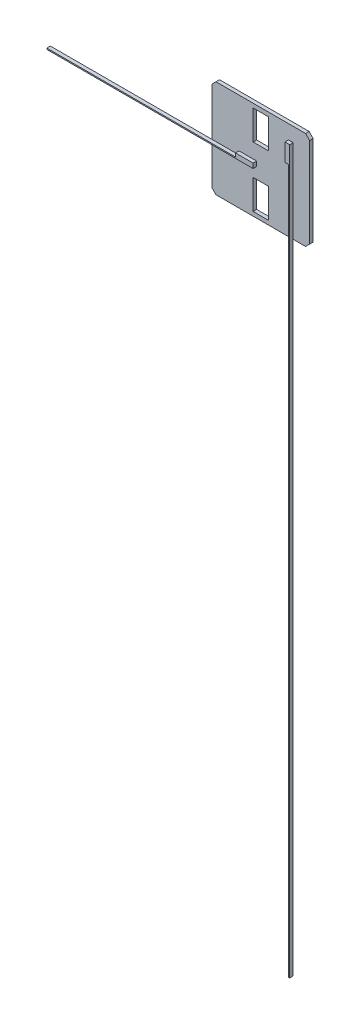
ISO-10303-21;
HEADER;
FILE_DESCRIPTION(('STEP AP214'),'2;1');
FILE_NAME('part.step','',(''),(''),'','','');
FILE_SCHEMA(('AUTOMOTIVE_DESIGN { 1 0 10303 214 1 1 1 1 }'));
ENDSEC;
DATA;
#1=APPLICATION_CONTEXT('core data for automotive mechanical design processes');
#2=APPLICATION_PROTOCOL_DEFINITION('international standard','automotive_design',2000,#1);
#3=PRODUCT_CONTEXT('',#1,'mechanical');
#4=PRODUCT('Part','Part','',(#3));
#5=PRODUCT_RELATED_PRODUCT_CATEGORY('part','',(#4));
#6=PRODUCT_DEFINITION_FORMATION('','',#4);
#7=PRODUCT_DEFINITION_CONTEXT('part definition',#1,'design');
#8=PRODUCT_DEFINITION('design','',#6,#7);
#9=PRODUCT_DEFINITION_SHAPE('','',#8);
#10=(LENGTH_UNIT() NAMED_UNIT(*) SI_UNIT(.MILLI.,.METRE.));
#11=(NAMED_UNIT(*) PLANE_ANGLE_UNIT() SI_UNIT($,.RADIAN.));
#12=(NAMED_UNIT(*) SI_UNIT($,.STERADIAN.) SOLID_ANGLE_UNIT());
#13=UNCERTAINTY_MEASURE_WITH_UNIT(LENGTH_MEASURE(1.E-05),#10,'distance_accuracy_value','');
#14=(GEOMETRIC_REPRESENTATION_CONTEXT(3) GLOBAL_UNCERTAINTY_ASSIGNED_CONTEXT((#13)) GLOBAL_UNIT_ASSIGNED_CONTEXT((#10,
#11,#12)) REPRESENTATION_CONTEXT('',''));
#15=CARTESIAN_POINT('',(0.,0.,0.));
#16=DIRECTION('',(0.,0.,1.));
#17=DIRECTION('',(1.,0.,0.));
#18=AXIS2_PLACEMENT_3D('',#15,#16,#17);
#19=CARTESIAN_POINT('',(0.,0.,3.));
#20=DIRECTION('',(0.,0.,1.));
#21=DIRECTION('',(1.,0.,0.));
#22=AXIS2_PLACEMENT_3D('',#19,#20,#21);
#23=PLANE('',#22);
#24=DIRECTION('',(1.,0.,0.));
#25=VECTOR('',#24,1.);
#26=CARTESIAN_POINT('',(-6.50000000000001,-38.,3.));
#27=LINE('',#26,#25);
#28=CARTESIAN_POINT('',(-6.50000000000001,-38.,3.));
#29=VERTEX_POINT('',#28);
#30=CARTESIAN_POINT('',(6.49999999999999,-38.,3.));
#31=VERTEX_POINT('',#30);
#32=EDGE_CURVE('E337',#29,#31,#27,.T.);
#33=ORIENTED_EDGE('',*,*,#32,.F.);
#34=DIRECTION('',(0.,-1.,0.));
#35=VECTOR('',#34,1.);
#36=CARTESIAN_POINT('',(-6.50000000000001,-38.,3.));
#37=LINE('',#36,#35);
#38=CARTESIAN_POINT('',(-6.50000000000001,-13.,3.));
#39=VERTEX_POINT('',#38);
#40=EDGE_CURVE('E342',#39,#29,#37,.T.);
#41=ORIENTED_EDGE('',*,*,#40,.F.);
#42=DIRECTION('',(-1.,0.,0.));
#43=VECTOR('',#42,1.);
#44=CARTESIAN_POINT('',(-6.50000000000001,-13.,3.));
#45=LINE('',#44,#43);
#46=CARTESIAN_POINT('',(6.49999999999999,-13.,3.));
#47=VERTEX_POINT('',#46);
#48=EDGE_CURVE('E356',#47,#39,#45,.T.);
#49=ORIENTED_EDGE('',*,*,#48,.F.);
#50=DIRECTION('',(0.,1.,0.));
#51=VECTOR('',#50,1.);
#52=CARTESIAN_POINT('',(6.49999999999999,-38.,3.));
#53=LINE('',#52,#51);
#54=EDGE_CURVE('E353',#31,#47,#53,.T.);
#55=ORIENTED_EDGE('',*,*,#54,.F.);
#56=EDGE_LOOP('',(#33,#41,#49,#55));
#57=FACE_BOUND('',#56,.T.);
#58=DIRECTION('',(0.,-1.,0.));
#59=VECTOR('',#58,1.);
#60=CARTESIAN_POINT('',(-6.50000000000001,38.,3.));
#61=LINE('',#60,#59);
#62=CARTESIAN_POINT('',(-6.50000000000001,38.,3.));
#63=VERTEX_POINT('',#62);
#64=CARTESIAN_POINT('',(-6.50000000000001,13.,3.));
#65=VERTEX_POINT('',#64);
#66=EDGE_CURVE('E363',#63,#65,#61,.T.);
#67=ORIENTED_EDGE('',*,*,#66,.F.);
#68=DIRECTION('',(-1.,0.,0.));
#69=VECTOR('',#68,1.);
#70=CARTESIAN_POINT('',(-6.50000000000001,38.,3.));
#71=LINE('',#70,#69);
#72=CARTESIAN_POINT('',(6.49999999999999,38.,3.));
#73=VERTEX_POINT('',#72);
#74=EDGE_CURVE('E374',#73,#63,#71,.T.);
#75=ORIENTED_EDGE('',*,*,#74,.F.);
#76=DIRECTION('',(0.,1.,0.));
#77=VECTOR('',#76,1.);
#78=CARTESIAN_POINT('',(6.49999999999999,38.,3.));
#79=LINE('',#78,#77);
#80=CARTESIAN_POINT('',(6.49999999999999,13.,3.));
#81=VERTEX_POINT('',#80);
#82=EDGE_CURVE('E388',#81,#73,#79,.T.);
#83=ORIENTED_EDGE('',*,*,#82,.F.);
#84=DIRECTION('',(1.,0.,0.));
#85=VECTOR('',#84,1.);
#86=CARTESIAN_POINT('',(-6.50000000000001,13.,3.));
#87=LINE('',#86,#85);
#88=EDGE_CURVE('E385',#65,#81,#87,.T.);
#89=ORIENTED_EDGE('',*,*,#88,.F.);
#90=EDGE_LOOP('',(#67,#75,#83,#89));
#91=FACE_BOUND('',#90,.T.);
#92=DIRECTION('',(-1.,0.,0.));
#93=VECTOR('',#92,1.);
#94=CARTESIAN_POINT('',(23.5,29.5,3.));
#95=LINE('',#94,#93);
#96=CARTESIAN_POINT('',(27.5,29.5,3.));
#97=VERTEX_POINT('',#96);
#98=CARTESIAN_POINT('',(23.5,29.5,3.));
#99=VERTEX_POINT('',#98);
#100=EDGE_CURVE('E300',#97,#99,#95,.T.);
#101=ORIENTED_EDGE('',*,*,#100,.F.);
#102=DIRECTION('',(0.,1.,0.));
#103=VECTOR('',#102,1.);
#104=CARTESIAN_POINT('',(27.5,29.5,3.));
#105=LINE('',#104,#103);
#106=CARTESIAN_POINT('',(27.5,-41.5,2.99999999999999));
#107=VERTEX_POINT('',#106);
#108=EDGE_CURVE('E244',#107,#97,#105,.T.);
#109=ORIENTED_EDGE('',*,*,#108,.F.);
#110=DIRECTION('',(1.,0.,0.));
#111=VECTOR('',#110,1.);
#112=CARTESIAN_POINT('',(41.5,-41.5,3.));
#113=LINE('',#112,#111);
#114=CARTESIAN_POINT('',(38.,-41.5,3.));
#115=VERTEX_POINT('',#114);
#116=EDGE_CURVE('E405',#107,#115,#113,.T.);
#117=ORIENTED_EDGE('',*,*,#116,.T.);
#118=DIRECTION('',(-0.707106781186549,-0.707106781186546,0.));
#119=VECTOR('',#118,1.);
#120=CARTESIAN_POINT('',(39.7499999999999,-39.7500000000001,3.));
#121=LINE('',#120,#119);
#122=CARTESIAN_POINT('',(41.5,-38.,3.));
#123=VERTEX_POINT('',#122);
#124=EDGE_CURVE('E449',#115,#123,#121,.F.);
#125=ORIENTED_EDGE('',*,*,#124,.T.);
#126=DIRECTION('',(0.,1.,0.));
#127=VECTOR('',#126,1.);
#128=CARTESIAN_POINT('',(41.5,-41.5,3.));
#129=LINE('',#128,#127);
#130=CARTESIAN_POINT('',(41.5,38.,3.));
#131=VERTEX_POINT('',#130);
#132=EDGE_CURVE('E410',#123,#131,#129,.T.);
#133=ORIENTED_EDGE('',*,*,#132,.T.);
#134=DIRECTION('',(0.707106781186546,-0.707106781186549,0.));
#135=VECTOR('',#134,1.);
#136=CARTESIAN_POINT('',(39.7500000000001,39.7499999999999,3.));
#137=LINE('',#136,#135);
#138=CARTESIAN_POINT('',(38.,41.5,3.));
#139=VERTEX_POINT('',#138);
#140=EDGE_CURVE('E447',#131,#139,#137,.F.);
#141=ORIENTED_EDGE('',*,*,#140,.T.);
#142=DIRECTION('',(-1.,0.,0.));
#143=VECTOR('',#142,1.);
#144=CARTESIAN_POINT('',(41.5,41.5,3.));
#145=LINE('',#144,#143);
#146=CARTESIAN_POINT('',(-38.,41.5,3.));
#147=VERTEX_POINT('',#146);
#148=EDGE_CURVE('E413',#139,#147,#145,.T.);
#149=ORIENTED_EDGE('',*,*,#148,.T.);
#150=DIRECTION('',(0.707106781186549,0.707106781186546,0.));
#151=VECTOR('',#150,1.);
#152=CARTESIAN_POINT('',(-39.7499999999999,39.7500000000001,3.));
#153=LINE('',#152,#151);
#154=CARTESIAN_POINT('',(-41.5,38.,3.));
#155=VERTEX_POINT('',#154);
#156=EDGE_CURVE('E445',#147,#155,#153,.F.);
#157=ORIENTED_EDGE('',*,*,#156,.T.);
#158=DIRECTION('',(0.,-1.,0.));
#159=VECTOR('',#158,1.);
#160=CARTESIAN_POINT('',(-41.5,-41.5,3.));
#161=LINE('',#160,#159);
#162=CARTESIAN_POINT('',(-41.5,-2.49999999999999,3.));
#163=VERTEX_POINT('',#162);
#164=EDGE_CURVE('E402',#155,#163,#161,.T.);
#165=ORIENTED_EDGE('',*,*,#164,.T.);
#166=DIRECTION('',(1.,0.,0.));
#167=VECTOR('',#166,1.);
#168=CARTESIAN_POINT('',(-178.5,-2.49999999999999,3.));
#169=LINE('',#168,#167);
#170=CARTESIAN_POINT('',(-18.5,-2.49999999999999,3.));
#171=VERTEX_POINT('',#170);
#172=EDGE_CURVE('E284',#163,#171,#169,.T.);
#173=ORIENTED_EDGE('',*,*,#172,.T.);
#174=DIRECTION('',(0.,-1.,0.));
#175=VECTOR('',#174,1.);
#176=CARTESIAN_POINT('',(-18.5,0.500000000000007,3.));
#177=LINE('',#176,#175);
#178=CARTESIAN_POINT('',(-18.5,0.500000000000007,3.));
#179=VERTEX_POINT('',#178);
#180=EDGE_CURVE('E317',#179,#171,#177,.T.);
#181=ORIENTED_EDGE('',*,*,#180,.F.);
#182=DIRECTION('',(-1.,0.,0.));
#183=VECTOR('',#182,1.);
#184=CARTESIAN_POINT('',(-18.5,0.500000000000007,3.));
#185=LINE('',#184,#183);
#186=CARTESIAN_POINT('',(-3.49999999999999,0.500000000000007,3.));
#187=VERTEX_POINT('',#186);
#188=EDGE_CURVE('E322',#187,#179,#185,.T.);
#189=ORIENTED_EDGE('',*,*,#188,.F.);
#190=DIRECTION('',(0.,1.,0.));
#191=VECTOR('',#190,1.);
#192=CARTESIAN_POINT('',(-3.49999999999999,0.500000000000007,3.));
#193=LINE('',#192,#191);
#194=CARTESIAN_POINT('',(-3.49999999999999,-3.49999999999999,3.));
#195=VERTEX_POINT('',#194);
#196=EDGE_CURVE('E329',#195,#187,#193,.T.);
#197=ORIENTED_EDGE('',*,*,#196,.F.);
#198=DIRECTION('',(1.,0.,0.));
#199=VECTOR('',#198,1.);
#200=CARTESIAN_POINT('',(-178.5,-3.49999999999999,3.));
#201=LINE('',#200,#199);
#202=CARTESIAN_POINT('',(-41.5,-3.49999999999999,3.));
#203=VERTEX_POINT('',#202);
#204=EDGE_CURVE('E271',#203,#195,#201,.T.);
#205=ORIENTED_EDGE('',*,*,#204,.F.);
#206=CARTESIAN_POINT('',(-41.5,-38.,3.));
#207=VERTEX_POINT('',#206);
#208=EDGE_CURVE('E406',#203,#207,#161,.T.);
#209=ORIENTED_EDGE('',*,*,#208,.T.);
#210=DIRECTION('',(-0.707106781186546,0.707106781186549,0.));
#211=VECTOR('',#210,1.);
#212=CARTESIAN_POINT('',(-39.7500000000001,-39.7499999999999,3.));
#213=LINE('',#212,#211);
#214=CARTESIAN_POINT('',(-38.,-41.5,3.));
#215=VERTEX_POINT('',#214);
#216=EDGE_CURVE('E451',#207,#215,#213,.F.);
#217=ORIENTED_EDGE('',*,*,#216,.T.);
#218=CARTESIAN_POINT('',(26.5,-41.5,2.99999999999999));
#219=VERTEX_POINT('',#218);
#220=EDGE_CURVE('E407',#215,#219,#113,.T.);
#221=ORIENTED_EDGE('',*,*,#220,.T.);
#222=DIRECTION('',(0.,1.,0.));
#223=VECTOR('',#222,1.);
#224=CARTESIAN_POINT('',(26.5,29.5,3.));
#225=LINE('',#224,#223);
#226=CARTESIAN_POINT('',(26.5,14.5,3.));
#227=VERTEX_POINT('',#226);
#228=EDGE_CURVE('E496',#219,#227,#225,.T.);
#229=ORIENTED_EDGE('',*,*,#228,.T.);
#230=DIRECTION('',(1.,0.,0.));
#231=VECTOR('',#230,1.);
#232=CARTESIAN_POINT('',(23.5,14.5,3.));
#233=LINE('',#232,#231);
#234=CARTESIAN_POINT('',(23.5,14.5,3.));
#235=VERTEX_POINT('',#234);
#236=EDGE_CURVE('E307',#235,#227,#233,.T.);
#237=ORIENTED_EDGE('',*,*,#236,.F.);
#238=DIRECTION('',(0.,-1.,0.));
#239=VECTOR('',#238,1.);
#240=CARTESIAN_POINT('',(23.5,29.5,3.));
#241=LINE('',#240,#239);
#242=EDGE_CURVE('E296',#99,#235,#241,.T.);
#243=ORIENTED_EDGE('',*,*,#242,.F.);
#244=EDGE_LOOP('',(#101,#109,#117,#125,#133,#141,#149,#157,#165,#173,#181,#189,#197,#205,#209,
#217,#221,#229,#237,#243));
#245=FACE_BOUND('',#244,.T.);
#246=ADVANCED_FACE('F35',(#57,#91,#245),#23,.T.);
#247=CARTESIAN_POINT('',(-41.5,-41.5,3.));
#248=DIRECTION('',(1.,0.,0.));
#249=DIRECTION('',(0.,0.,-1.));
#250=AXIS2_PLACEMENT_3D('',#247,#248,#249);
#251=PLANE('',#250);
#252=DIRECTION('',(0.,-1.,0.));
#253=VECTOR('',#252,1.);
#254=CARTESIAN_POINT('',(-41.5,-41.5,0.));
#255=LINE('',#254,#253);
#256=CARTESIAN_POINT('',(-41.5,38.,0.));
#257=VERTEX_POINT('',#256);
#258=CARTESIAN_POINT('',(-41.5,-38.,0.));
#259=VERTEX_POINT('',#258);
#260=EDGE_CURVE('E395',#257,#259,#255,.T.);
#261=ORIENTED_EDGE('',*,*,#260,.T.);
#262=DIRECTION('',(0.,0.,1.));
#263=VECTOR('',#262,1.);
#264=CARTESIAN_POINT('',(-41.5,-38.,3.));
#265=LINE('',#264,#263);
#266=EDGE_CURVE('E442',#259,#207,#265,.T.);
#267=ORIENTED_EDGE('',*,*,#266,.T.);
#268=ORIENTED_EDGE('',*,*,#208,.F.);
#269=DIRECTION('',(0.,-1.,0.));
#270=VECTOR('',#269,1.);
#271=CARTESIAN_POINT('',(-41.5,-41.5,3.));
#272=LINE('',#271,#270);
#273=EDGE_CURVE('E294',#163,#203,#272,.T.);
#274=ORIENTED_EDGE('',*,*,#273,.F.);
#275=ORIENTED_EDGE('',*,*,#164,.F.);
#276=DIRECTION('',(0.,0.,-1.));
#277=VECTOR('',#276,1.);
#278=CARTESIAN_POINT('',(-41.5,38.,3.));
#279=LINE('',#278,#277);
#280=EDGE_CURVE('E439',#155,#257,#279,.T.);
#281=ORIENTED_EDGE('',*,*,#280,.T.);
#282=EDGE_LOOP('',(#261,#267,#268,#274,#275,#281));
#283=FACE_BOUND('',#282,.T.);
#284=ADVANCED_FACE('F481',(#283),#251,.F.);
#285=CARTESIAN_POINT('',(41.5,-41.5,3.));
#286=DIRECTION('',(0.,1.,0.));
#287=DIRECTION('',(-1.,0.,0.));
#288=AXIS2_PLACEMENT_3D('',#285,#286,#287);
#289=PLANE('',#288);
#290=ORIENTED_EDGE('',*,*,#220,.F.);
#291=DIRECTION('',(0.,0.,-1.));
#292=VECTOR('',#291,1.);
#293=CARTESIAN_POINT('',(-38.,-41.5,3.));
#294=LINE('',#293,#292);
#295=CARTESIAN_POINT('',(-38.,-41.5,0.));
#296=VERTEX_POINT('',#295);
#297=EDGE_CURVE('E428',#215,#296,#294,.T.);
#298=ORIENTED_EDGE('',*,*,#297,.T.);
#299=DIRECTION('',(1.,0.,0.));
#300=VECTOR('',#299,1.);
#301=CARTESIAN_POINT('',(41.5,-41.5,0.));
#302=LINE('',#301,#300);
#303=CARTESIAN_POINT('',(38.,-41.5,0.));
#304=VERTEX_POINT('',#303);
#305=EDGE_CURVE('E418',#296,#304,#302,.T.);
#306=ORIENTED_EDGE('',*,*,#305,.T.);
#307=DIRECTION('',(0.,0.,1.));
#308=VECTOR('',#307,1.);
#309=CARTESIAN_POINT('',(38.,-41.5,3.));
#310=LINE('',#309,#308);
#311=EDGE_CURVE('E415',#304,#115,#310,.T.);
#312=ORIENTED_EDGE('',*,*,#311,.T.);
#313=ORIENTED_EDGE('',*,*,#116,.F.);
#314=DIRECTION('',(1.,0.,0.));
#315=VECTOR('',#314,1.);
#316=CARTESIAN_POINT('',(41.5,-41.5,2.99999999999999));
#317=LINE('',#316,#315);
#318=EDGE_CURVE('E261',#219,#107,#317,.T.);
#319=ORIENTED_EDGE('',*,*,#318,.F.);
#320=EDGE_LOOP('',(#290,#298,#306,#312,#313,#319));
#321=FACE_BOUND('',#320,.T.);
#322=ADVANCED_FACE('F490',(#321),#289,.F.);
#323=CARTESIAN_POINT('',(41.5,-41.5,3.));
#324=DIRECTION('',(-1.,0.,0.));
#325=DIRECTION('',(0.,0.,1.));
#326=AXIS2_PLACEMENT_3D('',#323,#324,#325);
#327=PLANE('',#326);
#328=ORIENTED_EDGE('',*,*,#132,.F.);
#329=DIRECTION('',(0.,0.,-1.));
#330=VECTOR('',#329,1.);
#331=CARTESIAN_POINT('',(41.5,-38.,3.));
#332=LINE('',#331,#330);
#333=CARTESIAN_POINT('',(41.5,-38.,0.));
#334=VERTEX_POINT('',#333);
#335=EDGE_CURVE('E455',#123,#334,#332,.T.);
#336=ORIENTED_EDGE('',*,*,#335,.T.);
#337=DIRECTION('',(0.,1.,0.));
#338=VECTOR('',#337,1.);
#339=CARTESIAN_POINT('',(41.5,-41.5,0.));
#340=LINE('',#339,#338);
#341=CARTESIAN_POINT('',(41.5,38.,0.));
#342=VERTEX_POINT('',#341);
#343=EDGE_CURVE('E421',#334,#342,#340,.T.);
#344=ORIENTED_EDGE('',*,*,#343,.T.);
#345=DIRECTION('',(0.,0.,1.));
#346=VECTOR('',#345,1.);
#347=CARTESIAN_POINT('',(41.5,38.,3.));
#348=LINE('',#347,#346);
#349=EDGE_CURVE('E453',#342,#131,#348,.T.);
#350=ORIENTED_EDGE('',*,*,#349,.T.);
#351=EDGE_LOOP('',(#328,#336,#344,#350));
#352=FACE_BOUND('',#351,.T.);
#353=ADVANCED_FACE('F461',(#352),#327,.F.);
#354=CARTESIAN_POINT('',(41.5,41.5,3.));
#355=DIRECTION('',(0.,-1.,0.));
#356=DIRECTION('',(1.,0.,0.));
#357=AXIS2_PLACEMENT_3D('',#354,#355,#356);
#358=PLANE('',#357);
#359=ORIENTED_EDGE('',*,*,#148,.F.);
#360=DIRECTION('',(0.,0.,-1.));
#361=VECTOR('',#360,1.);
#362=CARTESIAN_POINT('',(38.,41.5,3.));
#363=LINE('',#362,#361);
#364=CARTESIAN_POINT('',(38.,41.5,0.));
#365=VERTEX_POINT('',#364);
#366=EDGE_CURVE('E11',#139,#365,#363,.T.);
#367=ORIENTED_EDGE('',*,*,#366,.T.);
#368=DIRECTION('',(-1.,0.,0.));
#369=VECTOR('',#368,1.);
#370=CARTESIAN_POINT('',(41.5,41.5,0.));
#371=LINE('',#370,#369);
#372=CARTESIAN_POINT('',(-38.,41.5,0.));
#373=VERTEX_POINT('',#372);
#374=EDGE_CURVE('E424',#365,#373,#371,.T.);
#375=ORIENTED_EDGE('',*,*,#374,.T.);
#376=DIRECTION('',(0.,0.,1.));
#377=VECTOR('',#376,1.);
#378=CARTESIAN_POINT('',(-38.,41.5,3.));
#379=LINE('',#378,#377);
#380=EDGE_CURVE('E43',#373,#147,#379,.T.);
#381=ORIENTED_EDGE('',*,*,#380,.T.);
#382=EDGE_LOOP('',(#359,#367,#375,#381));
#383=FACE_BOUND('',#382,.T.);
#384=ADVANCED_FACE('F473',(#383),#358,.F.);
#385=CARTESIAN_POINT('',(0.,0.,0.));
#386=DIRECTION('',(0.,0.,1.));
#387=DIRECTION('',(1.,0.,0.));
#388=AXIS2_PLACEMENT_3D('',#385,#386,#387);
#389=PLANE('',#388);
#390=DIRECTION('',(0.,-1.,0.));
#391=VECTOR('',#390,1.);
#392=CARTESIAN_POINT('',(-6.50000000000001,-38.,0.));
#393=LINE('',#392,#391);
#394=CARTESIAN_POINT('',(-6.50000000000001,-13.,0.));
#395=VERTEX_POINT('',#394);
#396=CARTESIAN_POINT('',(-6.50000000000001,-38.,0.));
#397=VERTEX_POINT('',#396);
#398=EDGE_CURVE('E348',#395,#397,#393,.T.);
#399=ORIENTED_EDGE('',*,*,#398,.T.);
#400=DIRECTION('',(1.,0.,0.));
#401=VECTOR('',#400,1.);
#402=CARTESIAN_POINT('',(-6.50000000000001,-38.,0.));
#403=LINE('',#402,#401);
#404=CARTESIAN_POINT('',(6.49999999999999,-38.,0.));
#405=VERTEX_POINT('',#404);
#406=EDGE_CURVE('E338',#397,#405,#403,.T.);
#407=ORIENTED_EDGE('',*,*,#406,.T.);
#408=DIRECTION('',(0.,1.,0.));
#409=VECTOR('',#408,1.);
#410=CARTESIAN_POINT('',(6.49999999999999,-38.,0.));
#411=LINE('',#410,#409);
#412=CARTESIAN_POINT('',(6.49999999999999,-13.,0.));
#413=VERTEX_POINT('',#412);
#414=EDGE_CURVE('E341',#405,#413,#411,.T.);
#415=ORIENTED_EDGE('',*,*,#414,.T.);
#416=DIRECTION('',(-1.,0.,0.));
#417=VECTOR('',#416,1.);
#418=CARTESIAN_POINT('',(-6.50000000000001,-13.,0.));
#419=LINE('',#418,#417);
#420=EDGE_CURVE('E345',#413,#395,#419,.T.);
#421=ORIENTED_EDGE('',*,*,#420,.T.);
#422=EDGE_LOOP('',(#399,#407,#415,#421));
#423=FACE_BOUND('',#422,.T.);
#424=DIRECTION('',(-1.,0.,0.));
#425=VECTOR('',#424,1.);
#426=CARTESIAN_POINT('',(-6.50000000000001,38.,0.));
#427=LINE('',#426,#425);
#428=CARTESIAN_POINT('',(6.49999999999999,38.,0.));
#429=VERTEX_POINT('',#428);
#430=CARTESIAN_POINT('',(-6.50000000000001,38.,0.));
#431=VERTEX_POINT('',#430);
#432=EDGE_CURVE('E380',#429,#431,#427,.T.);
#433=ORIENTED_EDGE('',*,*,#432,.T.);
#434=DIRECTION('',(0.,-1.,0.));
#435=VECTOR('',#434,1.);
#436=CARTESIAN_POINT('',(-6.50000000000001,38.,0.));
#437=LINE('',#436,#435);
#438=CARTESIAN_POINT('',(-6.50000000000001,13.,0.));
#439=VERTEX_POINT('',#438);
#440=EDGE_CURVE('E370',#431,#439,#437,.T.);
#441=ORIENTED_EDGE('',*,*,#440,.T.);
#442=DIRECTION('',(1.,0.,0.));
#443=VECTOR('',#442,1.);
#444=CARTESIAN_POINT('',(-6.50000000000001,13.,0.));
#445=LINE('',#444,#443);
#446=CARTESIAN_POINT('',(6.49999999999999,13.,0.));
#447=VERTEX_POINT('',#446);
#448=EDGE_CURVE('E373',#439,#447,#445,.T.);
#449=ORIENTED_EDGE('',*,*,#448,.T.);
#450=DIRECTION('',(0.,1.,0.));
#451=VECTOR('',#450,1.);
#452=CARTESIAN_POINT('',(6.49999999999999,38.,0.));
#453=LINE('',#452,#451);
#454=EDGE_CURVE('E377',#447,#429,#453,.T.);
#455=ORIENTED_EDGE('',*,*,#454,.T.);
#456=EDGE_LOOP('',(#433,#441,#449,#455));
#457=FACE_BOUND('',#456,.T.);
#458=ORIENTED_EDGE('',*,*,#305,.F.);
#459=DIRECTION('',(0.707106781186546,-0.707106781186549,0.));
#460=VECTOR('',#459,1.);
#461=CARTESIAN_POINT('',(-38.,-41.5,0.));
#462=LINE('',#461,#460);
#463=EDGE_CURVE('E437',#296,#259,#462,.F.);
#464=ORIENTED_EDGE('',*,*,#463,.T.);
#465=ORIENTED_EDGE('',*,*,#260,.F.);
#466=DIRECTION('',(-0.707106781186549,-0.707106781186546,0.));
#467=VECTOR('',#466,1.);
#468=CARTESIAN_POINT('',(-41.5,38.,0.));
#469=LINE('',#468,#467);
#470=EDGE_CURVE('E431',#257,#373,#469,.F.);
#471=ORIENTED_EDGE('',*,*,#470,.T.);
#472=ORIENTED_EDGE('',*,*,#374,.F.);
#473=DIRECTION('',(-0.707106781186546,0.707106781186549,0.));
#474=VECTOR('',#473,1.);
#475=CARTESIAN_POINT('',(38.,41.5,0.));
#476=LINE('',#475,#474);
#477=EDGE_CURVE('E433',#365,#342,#476,.F.);
#478=ORIENTED_EDGE('',*,*,#477,.T.);
#479=ORIENTED_EDGE('',*,*,#343,.F.);
#480=DIRECTION('',(0.707106781186549,0.707106781186546,0.));
#481=VECTOR('',#480,1.);
#482=CARTESIAN_POINT('',(41.5,-38.,0.));
#483=LINE('',#482,#481);
#484=EDGE_CURVE('E435',#334,#304,#483,.F.);
#485=ORIENTED_EDGE('',*,*,#484,.T.);
#486=EDGE_LOOP('',(#458,#464,#465,#471,#472,#478,#479,#485));
#487=FACE_BOUND('',#486,.T.);
#488=ADVANCED_FACE('F467',(#423,#457,#487),#389,.F.);
#489=CARTESIAN_POINT('',(-6.50000000000001,38.,0.));
#490=DIRECTION('',(-1.,0.,0.));
#491=DIRECTION('',(0.,-1.,0.));
#492=AXIS2_PLACEMENT_3D('',#489,#490,#491);
#493=PLANE('',#492);
#494=ORIENTED_EDGE('',*,*,#66,.T.);
#495=DIRECTION('',(0.,0.,1.));
#496=VECTOR('',#495,1.);
#497=CARTESIAN_POINT('',(-6.50000000000001,13.,0.));
#498=LINE('',#497,#496);
#499=EDGE_CURVE('E383',#439,#65,#498,.T.);
#500=ORIENTED_EDGE('',*,*,#499,.F.);
#501=ORIENTED_EDGE('',*,*,#440,.F.);
#502=DIRECTION('',(0.,0.,1.));
#503=VECTOR('',#502,1.);
#504=CARTESIAN_POINT('',(-6.50000000000001,38.,0.));
#505=LINE('',#504,#503);
#506=EDGE_CURVE('E393',#431,#63,#505,.T.);
#507=ORIENTED_EDGE('',*,*,#506,.T.);
#508=EDGE_LOOP('',(#494,#500,#501,#507));
#509=FACE_BOUND('',#508,.T.);
#510=ADVANCED_FACE('F547',(#509),#493,.F.);
#511=CARTESIAN_POINT('',(-6.50000000000001,38.,0.));
#512=DIRECTION('',(0.,1.,0.));
#513=DIRECTION('',(-1.,0.,0.));
#514=AXIS2_PLACEMENT_3D('',#511,#512,#513);
#515=PLANE('',#514);
#516=ORIENTED_EDGE('',*,*,#74,.T.);
#517=ORIENTED_EDGE('',*,*,#506,.F.);
#518=ORIENTED_EDGE('',*,*,#432,.F.);
#519=DIRECTION('',(0.,0.,1.));
#520=VECTOR('',#519,1.);
#521=CARTESIAN_POINT('',(6.49999999999999,38.,0.));
#522=LINE('',#521,#520);
#523=EDGE_CURVE('E396',#429,#73,#522,.T.);
#524=ORIENTED_EDGE('',*,*,#523,.T.);
#525=EDGE_LOOP('',(#516,#517,#518,#524));
#526=FACE_BOUND('',#525,.T.);
#527=ADVANCED_FACE('F593',(#526),#515,.F.);
#528=CARTESIAN_POINT('',(6.49999999999999,38.,0.));
#529=DIRECTION('',(1.,0.,0.));
#530=DIRECTION('',(0.,1.,0.));
#531=AXIS2_PLACEMENT_3D('',#528,#529,#530);
#532=PLANE('',#531);
#533=ORIENTED_EDGE('',*,*,#82,.T.);
#534=ORIENTED_EDGE('',*,*,#523,.F.);
#535=ORIENTED_EDGE('',*,*,#454,.F.);
#536=DIRECTION('',(0.,0.,1.));
#537=VECTOR('',#536,1.);
#538=CARTESIAN_POINT('',(6.49999999999999,13.,0.));
#539=LINE('',#538,#537);
#540=EDGE_CURVE('E398',#447,#81,#539,.T.);
#541=ORIENTED_EDGE('',*,*,#540,.T.);
#542=EDGE_LOOP('',(#533,#534,#535,#541));
#543=FACE_BOUND('',#542,.T.);
#544=ADVANCED_FACE('F596',(#543),#532,.F.);
#545=CARTESIAN_POINT('',(-6.50000000000001,13.,0.));
#546=DIRECTION('',(0.,-1.,0.));
#547=DIRECTION('',(1.,0.,0.));
#548=AXIS2_PLACEMENT_3D('',#545,#546,#547);
#549=PLANE('',#548);
#550=ORIENTED_EDGE('',*,*,#88,.T.);
#551=ORIENTED_EDGE('',*,*,#540,.F.);
#552=ORIENTED_EDGE('',*,*,#448,.F.);
#553=ORIENTED_EDGE('',*,*,#499,.T.);
#554=EDGE_LOOP('',(#550,#551,#552,#553));
#555=FACE_BOUND('',#554,.T.);
#556=ADVANCED_FACE('F591',(#555),#549,.F.);
#557=CARTESIAN_POINT('',(-6.50000000000001,-38.,0.));
#558=DIRECTION('',(0.,-1.,0.));
#559=DIRECTION('',(1.,0.,0.));
#560=AXIS2_PLACEMENT_3D('',#557,#558,#559);
#561=PLANE('',#560);
#562=ORIENTED_EDGE('',*,*,#32,.T.);
#563=DIRECTION('',(0.,0.,1.));
#564=VECTOR('',#563,1.);
#565=CARTESIAN_POINT('',(6.49999999999999,-38.,0.));
#566=LINE('',#565,#564);
#567=EDGE_CURVE('E351',#405,#31,#566,.T.);
#568=ORIENTED_EDGE('',*,*,#567,.F.);
#569=ORIENTED_EDGE('',*,*,#406,.F.);
#570=DIRECTION('',(0.,0.,1.));
#571=VECTOR('',#570,1.);
#572=CARTESIAN_POINT('',(-6.50000000000001,-38.,0.));
#573=LINE('',#572,#571);
#574=EDGE_CURVE('E361',#397,#29,#573,.T.);
#575=ORIENTED_EDGE('',*,*,#574,.T.);
#576=EDGE_LOOP('',(#562,#568,#569,#575));
#577=FACE_BOUND('',#576,.T.);
#578=ADVANCED_FACE('F581',(#577),#561,.F.);
#579=CARTESIAN_POINT('',(-6.50000000000001,-38.,0.));
#580=DIRECTION('',(-1.,0.,0.));
#581=DIRECTION('',(0.,-1.,0.));
#582=AXIS2_PLACEMENT_3D('',#579,#580,#581);
#583=PLANE('',#582);
#584=ORIENTED_EDGE('',*,*,#40,.T.);
#585=ORIENTED_EDGE('',*,*,#574,.F.);
#586=ORIENTED_EDGE('',*,*,#398,.F.);
#587=DIRECTION('',(0.,0.,1.));
#588=VECTOR('',#587,1.);
#589=CARTESIAN_POINT('',(-6.50000000000001,-13.,0.));
#590=LINE('',#589,#588);
#591=EDGE_CURVE('E364',#395,#39,#590,.T.);
#592=ORIENTED_EDGE('',*,*,#591,.T.);
#593=EDGE_LOOP('',(#584,#585,#586,#592));
#594=FACE_BOUND('',#593,.T.);
#595=ADVANCED_FACE('F577',(#594),#583,.F.);
#596=CARTESIAN_POINT('',(-6.50000000000001,-13.,0.));
#597=DIRECTION('',(0.,1.,0.));
#598=DIRECTION('',(-1.,0.,0.));
#599=AXIS2_PLACEMENT_3D('',#596,#597,#598);
#600=PLANE('',#599);
#601=ORIENTED_EDGE('',*,*,#48,.T.);
#602=ORIENTED_EDGE('',*,*,#591,.F.);
#603=ORIENTED_EDGE('',*,*,#420,.F.);
#604=DIRECTION('',(0.,0.,1.));
#605=VECTOR('',#604,1.);
#606=CARTESIAN_POINT('',(6.49999999999999,-13.,0.));
#607=LINE('',#606,#605);
#608=EDGE_CURVE('E366',#413,#47,#607,.T.);
#609=ORIENTED_EDGE('',*,*,#608,.T.);
#610=EDGE_LOOP('',(#601,#602,#603,#609));
#611=FACE_BOUND('',#610,.T.);
#612=ADVANCED_FACE('F580',(#611),#600,.F.);
#613=CARTESIAN_POINT('',(6.49999999999999,-38.,0.));
#614=DIRECTION('',(1.,0.,0.));
#615=DIRECTION('',(0.,1.,0.));
#616=AXIS2_PLACEMENT_3D('',#613,#614,#615);
#617=PLANE('',#616);
#618=ORIENTED_EDGE('',*,*,#54,.T.);
#619=ORIENTED_EDGE('',*,*,#608,.F.);
#620=ORIENTED_EDGE('',*,*,#414,.F.);
#621=ORIENTED_EDGE('',*,*,#567,.T.);
#622=EDGE_LOOP('',(#618,#619,#620,#621));
#623=FACE_BOUND('',#622,.T.);
#624=ADVANCED_FACE('F561',(#623),#617,.F.);
#625=CARTESIAN_POINT('',(-38.,-41.5,3.));
#626=DIRECTION('',(0.707106781186549,0.707106781186546,0.));
#627=DIRECTION('',(0.,0.,-1.));
#628=AXIS2_PLACEMENT_3D('',#625,#626,#627);
#629=PLANE('',#628);
#630=ORIENTED_EDGE('',*,*,#216,.F.);
#631=ORIENTED_EDGE('',*,*,#266,.F.);
#632=ORIENTED_EDGE('',*,*,#463,.F.);
#633=ORIENTED_EDGE('',*,*,#297,.F.);
#634=EDGE_LOOP('',(#630,#631,#632,#633));
#635=FACE_BOUND('',#634,.T.);
#636=ADVANCED_FACE('F487',(#635),#629,.F.);
#637=CARTESIAN_POINT('',(41.5,-38.,3.));
#638=DIRECTION('',(-0.707106781186546,0.707106781186549,0.));
#639=DIRECTION('',(0.,0.,-1.));
#640=AXIS2_PLACEMENT_3D('',#637,#638,#639);
#641=PLANE('',#640);
#642=ORIENTED_EDGE('',*,*,#124,.F.);
#643=ORIENTED_EDGE('',*,*,#311,.F.);
#644=ORIENTED_EDGE('',*,*,#484,.F.);
#645=ORIENTED_EDGE('',*,*,#335,.F.);
#646=EDGE_LOOP('',(#642,#643,#644,#645));
#647=FACE_BOUND('',#646,.T.);
#648=ADVANCED_FACE('F560',(#647),#641,.F.);
#649=CARTESIAN_POINT('',(38.,41.5,3.));
#650=DIRECTION('',(-0.707106781186549,-0.707106781186546,0.));
#651=DIRECTION('',(0.,0.,-1.));
#652=AXIS2_PLACEMENT_3D('',#649,#650,#651);
#653=PLANE('',#652);
#654=ORIENTED_EDGE('',*,*,#140,.F.);
#655=ORIENTED_EDGE('',*,*,#349,.F.);
#656=ORIENTED_EDGE('',*,*,#477,.F.);
#657=ORIENTED_EDGE('',*,*,#366,.F.);
#658=EDGE_LOOP('',(#654,#655,#656,#657));
#659=FACE_BOUND('',#658,.T.);
#660=ADVANCED_FACE('F472',(#659),#653,.F.);
#661=CARTESIAN_POINT('',(-41.5,38.,3.));
#662=DIRECTION('',(0.707106781186546,-0.707106781186549,0.));
#663=DIRECTION('',(0.,0.,-1.));
#664=AXIS2_PLACEMENT_3D('',#661,#662,#663);
#665=PLANE('',#664);
#666=ORIENTED_EDGE('',*,*,#156,.F.);
#667=ORIENTED_EDGE('',*,*,#380,.F.);
#668=ORIENTED_EDGE('',*,*,#470,.F.);
#669=ORIENTED_EDGE('',*,*,#280,.F.);
#670=EDGE_LOOP('',(#666,#667,#668,#669));
#671=FACE_BOUND('',#670,.T.);
#672=ADVANCED_FACE('F37',(#671),#665,.F.);
#673=CARTESIAN_POINT('',(-18.5,0.500000000000007,6.));
#674=DIRECTION('',(1.,0.,0.));
#675=DIRECTION('',(0.,0.,-1.));
#676=AXIS2_PLACEMENT_3D('',#673,#674,#675);
#677=PLANE('',#676);
#678=ORIENTED_EDGE('',*,*,#180,.T.);
#679=DIRECTION('',(0.,0.,-1.));
#680=VECTOR('',#679,1.);
#681=CARTESIAN_POINT('',(-18.5,-2.49999999999999,6.));
#682=LINE('',#681,#680);
#683=CARTESIAN_POINT('',(-18.5,-2.49999999999999,6.));
#684=VERTEX_POINT('',#683);
#685=EDGE_CURVE('E335',#684,#171,#682,.T.);
#686=ORIENTED_EDGE('',*,*,#685,.F.);
#687=DIRECTION('',(0.,-1.,0.));
#688=VECTOR('',#687,1.);
#689=CARTESIAN_POINT('',(-18.5,0.500000000000007,6.));
#690=LINE('',#689,#688);
#691=CARTESIAN_POINT('',(-18.5,0.500000000000007,6.));
#692=VERTEX_POINT('',#691);
#693=EDGE_CURVE('E318',#692,#684,#690,.T.);
#694=ORIENTED_EDGE('',*,*,#693,.F.);
#695=DIRECTION('',(0.,0.,-1.));
#696=VECTOR('',#695,1.);
#697=CARTESIAN_POINT('',(-18.5,0.500000000000007,6.));
#698=LINE('',#697,#696);
#699=EDGE_CURVE('E326',#692,#179,#698,.T.);
#700=ORIENTED_EDGE('',*,*,#699,.T.);
#701=EDGE_LOOP('',(#678,#686,#694,#700));
#702=FACE_BOUND('',#701,.T.);
#703=ADVANCED_FACE('F507',(#702),#677,.F.);
#704=CARTESIAN_POINT('',(-3.49999999999999,0.500000000000007,6.));
#705=DIRECTION('',(-1.,0.,0.));
#706=DIRECTION('',(0.,0.,1.));
#707=AXIS2_PLACEMENT_3D('',#704,#705,#706);
#708=PLANE('',#707);
#709=ORIENTED_EDGE('',*,*,#196,.T.);
#710=DIRECTION('',(0.,0.,-1.));
#711=VECTOR('',#710,1.);
#712=CARTESIAN_POINT('',(-3.49999999999999,0.500000000000007,6.));
#713=LINE('',#712,#711);
#714=CARTESIAN_POINT('',(-3.49999999999999,0.500000000000007,6.));
#715=VERTEX_POINT('',#714);
#716=EDGE_CURVE('E50',#715,#187,#713,.T.);
#717=ORIENTED_EDGE('',*,*,#716,.F.);
#718=DIRECTION('',(0.,1.,0.));
#719=VECTOR('',#718,1.);
#720=CARTESIAN_POINT('',(-3.49999999999999,0.500000000000007,6.));
#721=LINE('',#720,#719);
#722=CARTESIAN_POINT('',(-3.49999999999999,-3.49999999999999,6.));
#723=VERTEX_POINT('',#722);
#724=EDGE_CURVE('E321',#723,#715,#721,.T.);
#725=ORIENTED_EDGE('',*,*,#724,.F.);
#726=DIRECTION('',(0.,0.,1.));
#727=VECTOR('',#726,1.);
#728=CARTESIAN_POINT('',(-3.49999999999999,-3.49999999999999,3.));
#729=LINE('',#728,#727);
#730=EDGE_CURVE('E276',#195,#723,#729,.T.);
#731=ORIENTED_EDGE('',*,*,#730,.F.);
#732=EDGE_LOOP('',(#709,#717,#725,#731));
#733=FACE_BOUND('',#732,.T.);
#734=ADVANCED_FACE('F516',(#733),#708,.F.);
#735=CARTESIAN_POINT('',(-18.5,0.500000000000007,6.));
#736=DIRECTION('',(0.,-1.,0.));
#737=DIRECTION('',(0.,0.,-1.));
#738=AXIS2_PLACEMENT_3D('',#735,#736,#737);
#739=PLANE('',#738);
#740=ORIENTED_EDGE('',*,*,#188,.T.);
#741=ORIENTED_EDGE('',*,*,#699,.F.);
#742=DIRECTION('',(-1.,0.,0.));
#743=VECTOR('',#742,1.);
#744=CARTESIAN_POINT('',(-18.5,0.500000000000007,6.));
#745=LINE('',#744,#743);
#746=EDGE_CURVE('E324',#715,#692,#745,.T.);
#747=ORIENTED_EDGE('',*,*,#746,.F.);
#748=ORIENTED_EDGE('',*,*,#716,.T.);
#749=EDGE_LOOP('',(#740,#741,#747,#748));
#750=FACE_BOUND('',#749,.T.);
#751=ADVANCED_FACE('F510',(#750),#739,.F.);
#752=CARTESIAN_POINT('',(0.,0.,6.));
#753=DIRECTION('',(0.,0.,1.));
#754=DIRECTION('',(1.,0.,0.));
#755=AXIS2_PLACEMENT_3D('',#752,#753,#754);
#756=PLANE('',#755);
#757=ORIENTED_EDGE('',*,*,#693,.T.);
#758=DIRECTION('',(-1.,0.,0.));
#759=VECTOR('',#758,1.);
#760=CARTESIAN_POINT('',(-178.5,-2.49999999999999,6.));
#761=LINE('',#760,#759);
#762=CARTESIAN_POINT('',(-178.5,-2.49999999999999,6.));
#763=VERTEX_POINT('',#762);
#764=EDGE_CURVE('E272',#684,#763,#761,.T.);
#765=ORIENTED_EDGE('',*,*,#764,.T.);
#766=DIRECTION('',(0.,1.,0.));
#767=VECTOR('',#766,1.);
#768=CARTESIAN_POINT('',(-178.5,-3.49999999999999,6.));
#769=LINE('',#768,#767);
#770=CARTESIAN_POINT('',(-178.5,-3.49999999999999,6.));
#771=VERTEX_POINT('',#770);
#772=EDGE_CURVE('E281',#771,#763,#769,.T.);
#773=ORIENTED_EDGE('',*,*,#772,.F.);
#774=DIRECTION('',(-1.,0.,0.));
#775=VECTOR('',#774,1.);
#776=CARTESIAN_POINT('',(-178.5,-3.49999999999999,6.));
#777=LINE('',#776,#775);
#778=EDGE_CURVE('E279',#723,#771,#777,.T.);
#779=ORIENTED_EDGE('',*,*,#778,.F.);
#780=ORIENTED_EDGE('',*,*,#724,.T.);
#781=ORIENTED_EDGE('',*,*,#746,.T.);
#782=EDGE_LOOP('',(#757,#765,#773,#779,#780,#781));
#783=FACE_BOUND('',#782,.T.);
#784=ADVANCED_FACE('F518',(#783),#756,.T.);
#785=CARTESIAN_POINT('',(23.5,29.5,6.));
#786=DIRECTION('',(1.,0.,0.));
#787=DIRECTION('',(0.,1.,0.));
#788=AXIS2_PLACEMENT_3D('',#785,#786,#787);
#789=PLANE('',#788);
#790=ORIENTED_EDGE('',*,*,#242,.T.);
#791=DIRECTION('',(0.,0.,-1.));
#792=VECTOR('',#791,1.);
#793=CARTESIAN_POINT('',(23.5,14.5,6.));
#794=LINE('',#793,#792);
#795=CARTESIAN_POINT('',(23.5,14.5,6.));
#796=VERTEX_POINT('',#795);
#797=EDGE_CURVE('E315',#796,#235,#794,.T.);
#798=ORIENTED_EDGE('',*,*,#797,.F.);
#799=DIRECTION('',(0.,-1.,0.));
#800=VECTOR('',#799,1.);
#801=CARTESIAN_POINT('',(23.5,29.5,6.));
#802=LINE('',#801,#800);
#803=CARTESIAN_POINT('',(23.5,29.5,6.));
#804=VERTEX_POINT('',#803);
#805=EDGE_CURVE('E297',#804,#796,#802,.T.);
#806=ORIENTED_EDGE('',*,*,#805,.F.);
#807=DIRECTION('',(0.,0.,-1.));
#808=VECTOR('',#807,1.);
#809=CARTESIAN_POINT('',(23.5,29.5,6.));
#810=LINE('',#809,#808);
#811=EDGE_CURVE('E304',#804,#99,#810,.T.);
#812=ORIENTED_EDGE('',*,*,#811,.T.);
#813=EDGE_LOOP('',(#790,#798,#806,#812));
#814=FACE_BOUND('',#813,.T.);
#815=ADVANCED_FACE('F708',(#814),#789,.F.);
#816=CARTESIAN_POINT('',(23.5,14.5,6.));
#817=DIRECTION('',(0.,1.,0.));
#818=DIRECTION('',(-1.,0.,0.));
#819=AXIS2_PLACEMENT_3D('',#816,#817,#818);
#820=PLANE('',#819);
#821=ORIENTED_EDGE('',*,*,#236,.T.);
#822=DIRECTION('',(0.,0.,-1.));
#823=VECTOR('',#822,1.);
#824=CARTESIAN_POINT('',(26.5,14.5,6.));
#825=LINE('',#824,#823);
#826=CARTESIAN_POINT('',(26.5,14.5,6.));
#827=VERTEX_POINT('',#826);
#828=EDGE_CURVE('E313',#827,#227,#825,.T.);
#829=ORIENTED_EDGE('',*,*,#828,.F.);
#830=DIRECTION('',(1.,0.,0.));
#831=VECTOR('',#830,1.);
#832=CARTESIAN_POINT('',(23.5,14.5,6.));
#833=LINE('',#832,#831);
#834=EDGE_CURVE('E299',#796,#827,#833,.T.);
#835=ORIENTED_EDGE('',*,*,#834,.F.);
#836=ORIENTED_EDGE('',*,*,#797,.T.);
#837=EDGE_LOOP('',(#821,#829,#835,#836));
#838=FACE_BOUND('',#837,.T.);
#839=ADVANCED_FACE('F713',(#838),#820,.F.);
#840=CARTESIAN_POINT('',(23.5,29.5,6.));
#841=DIRECTION('',(0.,-1.,0.));
#842=DIRECTION('',(0.,0.,-1.));
#843=AXIS2_PLACEMENT_3D('',#840,#841,#842);
#844=PLANE('',#843);
#845=ORIENTED_EDGE('',*,*,#100,.T.);
#846=ORIENTED_EDGE('',*,*,#811,.F.);
#847=DIRECTION('',(-1.,0.,0.));
#848=VECTOR('',#847,1.);
#849=CARTESIAN_POINT('',(23.5,29.5,6.));
#850=LINE('',#849,#848);
#851=CARTESIAN_POINT('',(27.5,29.5,6.));
#852=VERTEX_POINT('',#851);
#853=EDGE_CURVE('E302',#852,#804,#850,.T.);
#854=ORIENTED_EDGE('',*,*,#853,.F.);
#855=DIRECTION('',(0.,0.,1.));
#856=VECTOR('',#855,1.);
#857=CARTESIAN_POINT('',(27.5,29.5,6.));
#858=LINE('',#857,#856);
#859=EDGE_CURVE('E252',#97,#852,#858,.T.);
#860=ORIENTED_EDGE('',*,*,#859,.F.);
#861=EDGE_LOOP('',(#845,#846,#854,#860));
#862=FACE_BOUND('',#861,.T.);
#863=ADVANCED_FACE('F782',(#862),#844,.F.);
#864=CARTESIAN_POINT('',(0.,0.,6.));
#865=DIRECTION('',(0.,0.,1.));
#866=DIRECTION('',(1.,0.,0.));
#867=AXIS2_PLACEMENT_3D('',#864,#865,#866);
#868=PLANE('',#867);
#869=ORIENTED_EDGE('',*,*,#805,.T.);
#870=ORIENTED_EDGE('',*,*,#834,.T.);
#871=DIRECTION('',(0.,-1.,0.));
#872=VECTOR('',#871,1.);
#873=CARTESIAN_POINT('',(26.5,29.5,6.));
#874=LINE('',#873,#872);
#875=CARTESIAN_POINT('',(26.5000000000001,-582.5,5.99999999999993));
#876=VERTEX_POINT('',#875);
#877=EDGE_CURVE('E259',#827,#876,#874,.T.);
#878=ORIENTED_EDGE('',*,*,#877,.T.);
#879=DIRECTION('',(-1.,0.,0.));
#880=VECTOR('',#879,1.);
#881=CARTESIAN_POINT('',(27.5000000000001,-582.5,5.99999999999993));
#882=LINE('',#881,#880);
#883=CARTESIAN_POINT('',(27.5000000000001,-582.5,5.99999999999993));
#884=VERTEX_POINT('',#883);
#885=EDGE_CURVE('E238',#884,#876,#882,.T.);
#886=ORIENTED_EDGE('',*,*,#885,.F.);
#887=DIRECTION('',(0.,-1.,0.));
#888=VECTOR('',#887,1.);
#889=CARTESIAN_POINT('',(27.5,29.5,6.));
#890=LINE('',#889,#888);
#891=EDGE_CURVE('E245',#852,#884,#890,.T.);
#892=ORIENTED_EDGE('',*,*,#891,.F.);
#893=ORIENTED_EDGE('',*,*,#853,.T.);
#894=EDGE_LOOP('',(#869,#870,#878,#886,#892,#893));
#895=FACE_BOUND('',#894,.T.);
#896=ADVANCED_FACE('F257',(#895),#868,.T.);
#897=CARTESIAN_POINT('',(-178.5,-3.49999999999999,3.));
#898=DIRECTION('',(0.,0.,1.));
#899=DIRECTION('',(1.,0.,0.));
#900=AXIS2_PLACEMENT_3D('',#897,#898,#899);
#901=PLANE('',#900);
#902=CARTESIAN_POINT('',(-178.5,-2.49999999999999,3.));
#903=VERTEX_POINT('',#902);
#904=EDGE_CURVE('E285',#903,#163,#169,.T.);
#905=ORIENTED_EDGE('',*,*,#904,.T.);
#906=ORIENTED_EDGE('',*,*,#273,.T.);
#907=CARTESIAN_POINT('',(-178.5,-3.49999999999999,3.));
#908=VERTEX_POINT('',#907);
#909=EDGE_CURVE('E273',#908,#203,#201,.T.);
#910=ORIENTED_EDGE('',*,*,#909,.F.);
#911=DIRECTION('',(0.,1.,0.));
#912=VECTOR('',#911,1.);
#913=CARTESIAN_POINT('',(-178.5,-3.49999999999999,3.));
#914=LINE('',#913,#912);
#915=EDGE_CURVE('E291',#908,#903,#914,.T.);
#916=ORIENTED_EDGE('',*,*,#915,.T.);
#917=EDGE_LOOP('',(#905,#906,#910,#916));
#918=FACE_BOUND('',#917,.T.);
#919=ADVANCED_FACE('F525',(#918),#901,.F.);
#920=CARTESIAN_POINT('',(0.,-2.49999999999999,0.));
#921=DIRECTION('',(0.,1.,0.));
#922=DIRECTION('',(-1.,0.,0.));
#923=AXIS2_PLACEMENT_3D('',#920,#921,#922);
#924=PLANE('',#923);
#925=ORIENTED_EDGE('',*,*,#685,.T.);
#926=ORIENTED_EDGE('',*,*,#172,.F.);
#927=ORIENTED_EDGE('',*,*,#904,.F.);
#928=DIRECTION('',(0.,0.,-1.));
#929=VECTOR('',#928,1.);
#930=CARTESIAN_POINT('',(-178.5,-2.49999999999999,3.));
#931=LINE('',#930,#929);
#932=EDGE_CURVE('E263',#763,#903,#931,.T.);
#933=ORIENTED_EDGE('',*,*,#932,.F.);
#934=ORIENTED_EDGE('',*,*,#764,.F.);
#935=EDGE_LOOP('',(#925,#926,#927,#933,#934));
#936=FACE_BOUND('',#935,.T.);
#937=ADVANCED_FACE('F526',(#936),#924,.T.);
#938=CARTESIAN_POINT('',(-178.5,-3.49999999999999,3.));
#939=DIRECTION('',(1.,0.,0.));
#940=DIRECTION('',(0.,0.,-1.));
#941=AXIS2_PLACEMENT_3D('',#938,#939,#940);
#942=PLANE('',#941);
#943=ORIENTED_EDGE('',*,*,#932,.T.);
#944=ORIENTED_EDGE('',*,*,#915,.F.);
#945=DIRECTION('',(0.,0.,-1.));
#946=VECTOR('',#945,1.);
#947=CARTESIAN_POINT('',(-178.5,-3.49999999999999,3.));
#948=LINE('',#947,#946);
#949=EDGE_CURVE('E268',#771,#908,#948,.T.);
#950=ORIENTED_EDGE('',*,*,#949,.F.);
#951=ORIENTED_EDGE('',*,*,#772,.T.);
#952=EDGE_LOOP('',(#943,#944,#950,#951));
#953=FACE_BOUND('',#952,.T.);
#954=ADVANCED_FACE('F523',(#953),#942,.F.);
#955=CARTESIAN_POINT('',(0.,-3.49999999999999,0.));
#956=DIRECTION('',(0.,1.,0.));
#957=DIRECTION('',(-1.,0.,0.));
#958=AXIS2_PLACEMENT_3D('',#955,#956,#957);
#959=PLANE('',#958);
#960=ORIENTED_EDGE('',*,*,#949,.T.);
#961=ORIENTED_EDGE('',*,*,#909,.T.);
#962=ORIENTED_EDGE('',*,*,#204,.T.);
#963=ORIENTED_EDGE('',*,*,#730,.T.);
#964=ORIENTED_EDGE('',*,*,#778,.T.);
#965=EDGE_LOOP('',(#960,#961,#962,#963,#964));
#966=FACE_BOUND('',#965,.T.);
#967=ADVANCED_FACE('F514',(#966),#959,.F.);
#968=CARTESIAN_POINT('',(27.5,29.5,3.));
#969=DIRECTION('',(0.,0.,1.));
#970=DIRECTION('',(0.,-1.,0.));
#971=AXIS2_PLACEMENT_3D('',#968,#969,#970);
#972=PLANE('',#971);
#973=CARTESIAN_POINT('',(26.5000000000001,-582.5,2.99999999999992));
#974=VERTEX_POINT('',#973);
#975=EDGE_CURVE('E254',#974,#219,#225,.T.);
#976=ORIENTED_EDGE('',*,*,#975,.T.);
#977=ORIENTED_EDGE('',*,*,#318,.T.);
#978=CARTESIAN_POINT('',(27.5000000000001,-582.5,2.99999999999992));
#979=VERTEX_POINT('',#978);
#980=EDGE_CURVE('E846',#979,#107,#105,.T.);
#981=ORIENTED_EDGE('',*,*,#980,.F.);
#982=DIRECTION('',(-1.,0.,0.));
#983=VECTOR('',#982,1.);
#984=CARTESIAN_POINT('',(27.5000000000001,-582.5,2.99999999999992));
#985=LINE('',#984,#983);
#986=EDGE_CURVE('E240',#979,#974,#985,.T.);
#987=ORIENTED_EDGE('',*,*,#986,.T.);
#988=EDGE_LOOP('',(#976,#977,#981,#987));
#989=FACE_BOUND('',#988,.T.);
#990=ADVANCED_FACE('F764',(#989),#972,.F.);
#991=CARTESIAN_POINT('',(26.5,0.,0.));
#992=DIRECTION('',(1.,0.,0.));
#993=DIRECTION('',(0.,1.,0.));
#994=AXIS2_PLACEMENT_3D('',#991,#992,#993);
#995=PLANE('',#994);
#996=ORIENTED_EDGE('',*,*,#877,.F.);
#997=ORIENTED_EDGE('',*,*,#828,.T.);
#998=ORIENTED_EDGE('',*,*,#228,.F.);
#999=ORIENTED_EDGE('',*,*,#975,.F.);
#1000=DIRECTION('',(0.,0.,-1.));
#1001=VECTOR('',#1000,1.);
#1002=CARTESIAN_POINT('',(26.5000000000001,-582.5,5.99999999999993));
#1003=LINE('',#1002,#1001);
#1004=EDGE_CURVE('E839',#876,#974,#1003,.T.);
#1005=ORIENTED_EDGE('',*,*,#1004,.F.);
#1006=EDGE_LOOP('',(#996,#997,#998,#999,#1005));
#1007=FACE_BOUND('',#1006,.T.);
#1008=ADVANCED_FACE('F807',(#1007),#995,.F.);
#1009=CARTESIAN_POINT('',(27.5000000000001,-582.5,5.99999999999993));
#1010=DIRECTION('',(0.,1.,0.));
#1011=DIRECTION('',(-1.,0.,0.));
#1012=AXIS2_PLACEMENT_3D('',#1009,#1010,#1011);
#1013=PLANE('',#1012);
#1014=ORIENTED_EDGE('',*,*,#1004,.T.);
#1015=ORIENTED_EDGE('',*,*,#986,.F.);
#1016=DIRECTION('',(0.,0.,-1.));
#1017=VECTOR('',#1016,1.);
#1018=CARTESIAN_POINT('',(27.5000000000001,-582.5,5.99999999999993));
#1019=LINE('',#1018,#1017);
#1020=EDGE_CURVE('E234',#884,#979,#1019,.T.);
#1021=ORIENTED_EDGE('',*,*,#1020,.F.);
#1022=ORIENTED_EDGE('',*,*,#885,.T.);
#1023=EDGE_LOOP('',(#1014,#1015,#1021,#1022));
#1024=FACE_BOUND('',#1023,.T.);
#1025=ADVANCED_FACE('F236',(#1024),#1013,.F.);
#1026=CARTESIAN_POINT('',(27.5,0.,0.));
#1027=DIRECTION('',(1.,0.,0.));
#1028=DIRECTION('',(0.,1.,0.));
#1029=AXIS2_PLACEMENT_3D('',#1026,#1027,#1028);
#1030=PLANE('',#1029);
#1031=ORIENTED_EDGE('',*,*,#891,.T.);
#1032=ORIENTED_EDGE('',*,*,#1020,.T.);
#1033=ORIENTED_EDGE('',*,*,#980,.T.);
#1034=ORIENTED_EDGE('',*,*,#108,.T.);
#1035=ORIENTED_EDGE('',*,*,#859,.T.);
#1036=EDGE_LOOP('',(#1031,#1032,#1033,#1034,#1035));
#1037=FACE_BOUND('',#1036,.T.);
#1038=ADVANCED_FACE('F249',(#1037),#1030,.T.);
#1039=CLOSED_SHELL('',(#246,#284,#322,#353,#384,#488,#510,#527,#544,#556,#578,#595,#612,#624,
#636,#648,#660,#672,#703,#734,#751,#784,#815,#839,#863,#896,#919,#937,#954,#967,#990,#1008,
#1025,#1038));
#1040=MANIFOLD_SOLID_BREP('B2',#1039);
#1041=ADVANCED_BREP_SHAPE_REPRESENTATION('',(#18,#1040),#14);
#1042=SHAPE_DEFINITION_REPRESENTATION(#9,#1041);
ENDSEC;
END-ISO-10303-21;
